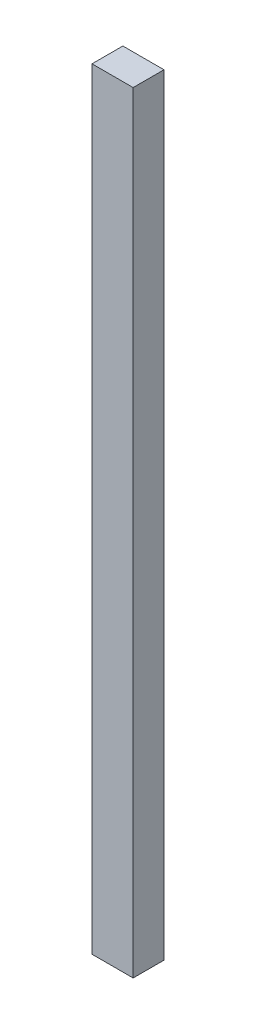
ISO-10303-21;
HEADER;
FILE_DESCRIPTION(('STEP AP214'),'2;1');
FILE_NAME('part.step','',(''),(''),'','','');
FILE_SCHEMA(('AUTOMOTIVE_DESIGN { 1 0 10303 214 1 1 1 1 }'));
ENDSEC;
DATA;
#1=APPLICATION_CONTEXT('core data for automotive mechanical design processes');
#2=APPLICATION_PROTOCOL_DEFINITION('international standard','automotive_design',2000,#1);
#3=PRODUCT_CONTEXT('',#1,'mechanical');
#4=PRODUCT('Part','Part','',(#3));
#5=PRODUCT_RELATED_PRODUCT_CATEGORY('part','',(#4));
#6=PRODUCT_DEFINITION_FORMATION('','',#4);
#7=PRODUCT_DEFINITION_CONTEXT('part definition',#1,'design');
#8=PRODUCT_DEFINITION('design','',#6,#7);
#9=PRODUCT_DEFINITION_SHAPE('','',#8);
#10=(LENGTH_UNIT() NAMED_UNIT(*) SI_UNIT(.MILLI.,.METRE.));
#11=(NAMED_UNIT(*) PLANE_ANGLE_UNIT() SI_UNIT($,.RADIAN.));
#12=(NAMED_UNIT(*) SI_UNIT($,.STERADIAN.) SOLID_ANGLE_UNIT());
#13=UNCERTAINTY_MEASURE_WITH_UNIT(LENGTH_MEASURE(1.E-05),#10,'distance_accuracy_value','');
#14=(GEOMETRIC_REPRESENTATION_CONTEXT(3) GLOBAL_UNCERTAINTY_ASSIGNED_CONTEXT((#13)) GLOBAL_UNIT_ASSIGNED_CONTEXT((#10,
#11,#12)) REPRESENTATION_CONTEXT('',''));
#15=CARTESIAN_POINT('',(0.,0.,0.));
#16=DIRECTION('',(0.,0.,1.));
#17=DIRECTION('',(1.,0.,0.));
#18=AXIS2_PLACEMENT_3D('',#15,#16,#17);
#19=CARTESIAN_POINT('',(0.,0.,30.));
#20=DIRECTION('',(1.,0.,0.));
#21=DIRECTION('',(0.,1.,0.));
#22=AXIS2_PLACEMENT_3D('',#19,#20,#21);
#23=PLANE('',#22);
#24=DIRECTION('',(0.,-1.,0.));
#25=VECTOR('',#24,1.);
#26=CARTESIAN_POINT('',(0.,0.,0.));
#27=LINE('',#26,#25);
#28=CARTESIAN_POINT('',(0.,0.,0.));
#29=VERTEX_POINT('',#28);
#30=CARTESIAN_POINT('',(0.,-750.,0.));
#31=VERTEX_POINT('',#30);
#32=EDGE_CURVE('E96',#29,#31,#27,.T.);
#33=ORIENTED_EDGE('',*,*,#32,.T.);
#34=DIRECTION('',(0.,0.,-1.));
#35=VECTOR('',#34,1.);
#36=CARTESIAN_POINT('',(0.,-750.,30.));
#37=LINE('',#36,#35);
#38=CARTESIAN_POINT('',(0.,-750.,30.));
#39=VERTEX_POINT('',#38);
#40=EDGE_CURVE('E11',#39,#31,#37,.T.);
#41=ORIENTED_EDGE('',*,*,#40,.F.);
#42=DIRECTION('',(0.,-1.,0.));
#43=VECTOR('',#42,1.);
#44=CARTESIAN_POINT('',(0.,0.,30.));
#45=LINE('',#44,#43);
#46=CARTESIAN_POINT('',(0.,0.,30.));
#47=VERTEX_POINT('',#46);
#48=EDGE_CURVE('E84',#47,#39,#45,.T.);
#49=ORIENTED_EDGE('',*,*,#48,.F.);
#50=DIRECTION('',(0.,0.,-1.));
#51=VECTOR('',#50,1.);
#52=CARTESIAN_POINT('',(0.,0.,30.));
#53=LINE('',#52,#51);
#54=EDGE_CURVE('E92',#47,#29,#53,.T.);
#55=ORIENTED_EDGE('',*,*,#54,.T.);
#56=EDGE_LOOP('',(#33,#41,#49,#55));
#57=FACE_BOUND('',#56,.T.);
#58=ADVANCED_FACE('F33',(#57),#23,.F.);
#59=CARTESIAN_POINT('',(0.,-750.,30.));
#60=DIRECTION('',(0.,1.,0.));
#61=DIRECTION('',(0.,0.,1.));
#62=AXIS2_PLACEMENT_3D('',#59,#60,#61);
#63=PLANE('',#62);
#64=DIRECTION('',(1.,0.,0.));
#65=VECTOR('',#64,1.);
#66=CARTESIAN_POINT('',(0.,-750.,0.));
#67=LINE('',#66,#65);
#68=CARTESIAN_POINT('',(40.0000000000001,-750.,0.));
#69=VERTEX_POINT('',#68);
#70=EDGE_CURVE('E88',#31,#69,#67,.T.);
#71=ORIENTED_EDGE('',*,*,#70,.T.);
#72=DIRECTION('',(0.,0.,-1.));
#73=VECTOR('',#72,1.);
#74=CARTESIAN_POINT('',(40.0000000000001,-750.,30.));
#75=LINE('',#74,#73);
#76=CARTESIAN_POINT('',(40.0000000000001,-750.,30.));
#77=VERTEX_POINT('',#76);
#78=EDGE_CURVE('E41',#77,#69,#75,.T.);
#79=ORIENTED_EDGE('',*,*,#78,.F.);
#80=DIRECTION('',(1.,0.,0.));
#81=VECTOR('',#80,1.);
#82=CARTESIAN_POINT('',(0.,-750.,30.));
#83=LINE('',#82,#81);
#84=EDGE_CURVE('E79',#39,#77,#83,.T.);
#85=ORIENTED_EDGE('',*,*,#84,.F.);
#86=ORIENTED_EDGE('',*,*,#40,.T.);
#87=EDGE_LOOP('',(#71,#79,#85,#86));
#88=FACE_BOUND('',#87,.T.);
#89=ADVANCED_FACE('F87',(#88),#63,.F.);
#90=CARTESIAN_POINT('',(40.,0.,30.));
#91=DIRECTION('',(-1.,0.,0.));
#92=DIRECTION('',(0.,-1.,0.));
#93=AXIS2_PLACEMENT_3D('',#90,#91,#92);
#94=PLANE('',#93);
#95=DIRECTION('',(0.,1.,0.));
#96=VECTOR('',#95,1.);
#97=CARTESIAN_POINT('',(40.,0.,0.));
#98=LINE('',#97,#96);
#99=CARTESIAN_POINT('',(40.,0.,0.));
#100=VERTEX_POINT('',#99);
#101=EDGE_CURVE('E66',#69,#100,#98,.T.);
#102=ORIENTED_EDGE('',*,*,#101,.T.);
#103=DIRECTION('',(0.,0.,-1.));
#104=VECTOR('',#103,1.);
#105=CARTESIAN_POINT('',(40.,0.,30.));
#106=LINE('',#105,#104);
#107=CARTESIAN_POINT('',(40.,0.,30.));
#108=VERTEX_POINT('',#107);
#109=EDGE_CURVE('E89',#108,#100,#106,.T.);
#110=ORIENTED_EDGE('',*,*,#109,.F.);
#111=DIRECTION('',(0.,1.,0.));
#112=VECTOR('',#111,1.);
#113=CARTESIAN_POINT('',(40.,0.,30.));
#114=LINE('',#113,#112);
#115=EDGE_CURVE('E82',#77,#108,#114,.T.);
#116=ORIENTED_EDGE('',*,*,#115,.F.);
#117=ORIENTED_EDGE('',*,*,#78,.T.);
#118=EDGE_LOOP('',(#102,#110,#116,#117));
#119=FACE_BOUND('',#118,.T.);
#120=ADVANCED_FACE('F90',(#119),#94,.F.);
#121=CARTESIAN_POINT('',(0.,0.,30.));
#122=DIRECTION('',(0.,-1.,0.));
#123=DIRECTION('',(0.,0.,-1.));
#124=AXIS2_PLACEMENT_3D('',#121,#122,#123);
#125=PLANE('',#124);
#126=DIRECTION('',(-1.,0.,0.));
#127=VECTOR('',#126,1.);
#128=CARTESIAN_POINT('',(0.,0.,0.));
#129=LINE('',#128,#127);
#130=EDGE_CURVE('E72',#100,#29,#129,.T.);
#131=ORIENTED_EDGE('',*,*,#130,.T.);
#132=ORIENTED_EDGE('',*,*,#54,.F.);
#133=DIRECTION('',(-1.,0.,0.));
#134=VECTOR('',#133,1.);
#135=CARTESIAN_POINT('',(0.,0.,30.));
#136=LINE('',#135,#134);
#137=EDGE_CURVE('E49',#108,#47,#136,.T.);
#138=ORIENTED_EDGE('',*,*,#137,.F.);
#139=ORIENTED_EDGE('',*,*,#109,.T.);
#140=EDGE_LOOP('',(#131,#132,#138,#139));
#141=FACE_BOUND('',#140,.T.);
#142=ADVANCED_FACE('F103',(#141),#125,.F.);
#143=CARTESIAN_POINT('',(0.,0.,30.));
#144=DIRECTION('',(0.,0.,1.));
#145=DIRECTION('',(1.,0.,0.));
#146=AXIS2_PLACEMENT_3D('',#143,#144,#145);
#147=PLANE('',#146);
#148=ORIENTED_EDGE('',*,*,#48,.T.);
#149=ORIENTED_EDGE('',*,*,#84,.T.);
#150=ORIENTED_EDGE('',*,*,#115,.T.);
#151=ORIENTED_EDGE('',*,*,#137,.T.);
#152=EDGE_LOOP('',(#148,#149,#150,#151));
#153=FACE_BOUND('',#152,.T.);
#154=ADVANCED_FACE('F80',(#153),#147,.T.);
#155=CARTESIAN_POINT('',(0.,0.,0.));
#156=DIRECTION('',(0.,0.,1.));
#157=DIRECTION('',(1.,0.,0.));
#158=AXIS2_PLACEMENT_3D('',#155,#156,#157);
#159=PLANE('',#158);
#160=ORIENTED_EDGE('',*,*,#32,.F.);
#161=ORIENTED_EDGE('',*,*,#130,.F.);
#162=ORIENTED_EDGE('',*,*,#101,.F.);
#163=ORIENTED_EDGE('',*,*,#70,.F.);
#164=EDGE_LOOP('',(#160,#161,#162,#163));
#165=FACE_BOUND('',#164,.T.);
#166=ADVANCED_FACE('F106',(#165),#159,.F.);
#167=CLOSED_SHELL('',(#58,#89,#120,#142,#154,#166));
#168=MANIFOLD_SOLID_BREP('B2',#167);
#169=ADVANCED_BREP_SHAPE_REPRESENTATION('',(#18,#168),#14);
#170=SHAPE_DEFINITION_REPRESENTATION(#9,#169);
ENDSEC;
END-ISO-10303-21;
